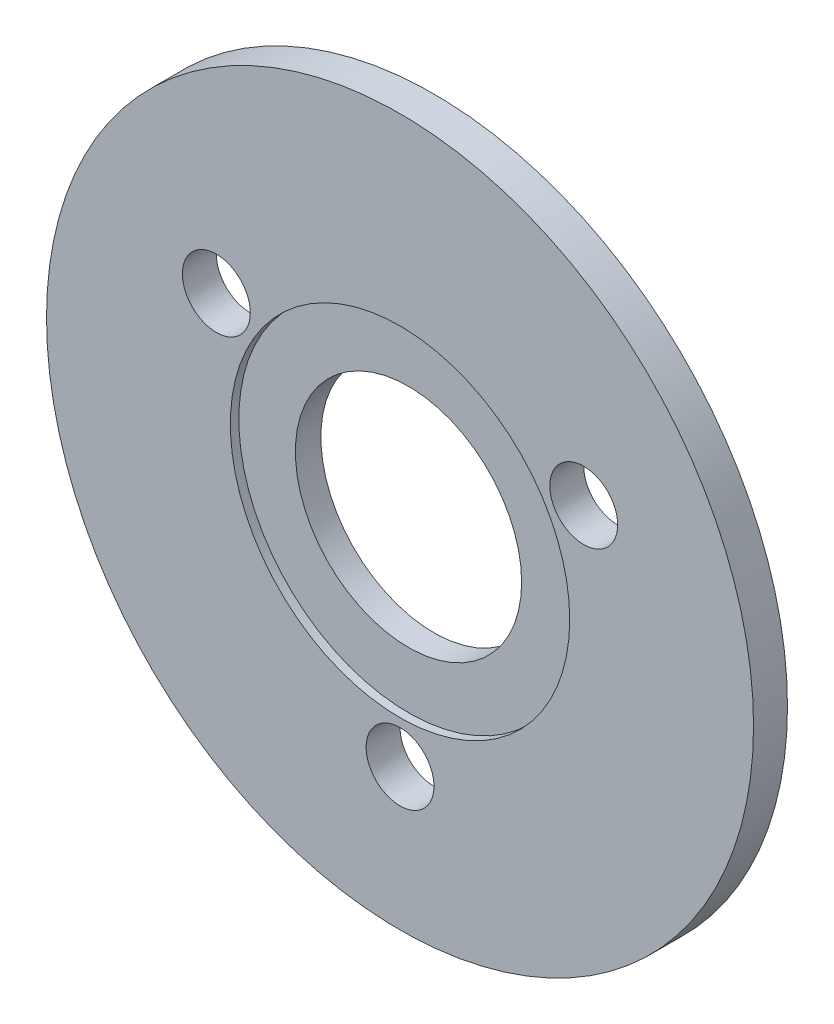
ISO-10303-21;
HEADER;
FILE_DESCRIPTION(('STEP AP214'),'2;1');
FILE_NAME('part.step','',(''),(''),'','','');
FILE_SCHEMA(('AUTOMOTIVE_DESIGN { 1 0 10303 214 1 1 1 1 }'));
ENDSEC;
DATA;
#1=APPLICATION_CONTEXT('core data for automotive mechanical design processes');
#2=APPLICATION_PROTOCOL_DEFINITION('international standard','automotive_design',2000,#1);
#3=PRODUCT_CONTEXT('',#1,'mechanical');
#4=PRODUCT('Part','Part','',(#3));
#5=PRODUCT_RELATED_PRODUCT_CATEGORY('part','',(#4));
#6=PRODUCT_DEFINITION_FORMATION('','',#4);
#7=PRODUCT_DEFINITION_CONTEXT('part definition',#1,'design');
#8=PRODUCT_DEFINITION('design','',#6,#7);
#9=PRODUCT_DEFINITION_SHAPE('','',#8);
#10=(LENGTH_UNIT() NAMED_UNIT(*) SI_UNIT(.MILLI.,.METRE.));
#11=(NAMED_UNIT(*) PLANE_ANGLE_UNIT() SI_UNIT($,.RADIAN.));
#12=(NAMED_UNIT(*) SI_UNIT($,.STERADIAN.) SOLID_ANGLE_UNIT());
#13=UNCERTAINTY_MEASURE_WITH_UNIT(LENGTH_MEASURE(1.E-05),#10,'distance_accuracy_value','');
#14=(GEOMETRIC_REPRESENTATION_CONTEXT(3) GLOBAL_UNCERTAINTY_ASSIGNED_CONTEXT((#13)) GLOBAL_UNIT_ASSIGNED_CONTEXT((#10,
#11,#12)) REPRESENTATION_CONTEXT('',''));
#15=CARTESIAN_POINT('',(0.,0.,0.));
#16=DIRECTION('',(0.,0.,1.));
#17=DIRECTION('',(1.,0.,0.));
#18=AXIS2_PLACEMENT_3D('',#15,#16,#17);
#19=CARTESIAN_POINT('',(0.,0.,1.2));
#20=DIRECTION('',(0.,0.,-1.));
#21=DIRECTION('',(-1.,0.,0.));
#22=AXIS2_PLACEMENT_3D('',#19,#20,#21);
#23=CYLINDRICAL_SURFACE('',#22,4.);
#24=CARTESIAN_POINT('',(0.,0.,0.));
#25=DIRECTION('',(0.,0.,1.));
#26=DIRECTION('',(1.,0.,0.));
#27=AXIS2_PLACEMENT_3D('',#24,#25,#26);
#28=CIRCLE('',#27,4.);
#29=CARTESIAN_POINT('',(4.,0.,0.));
#30=VERTEX_POINT('',#29);
#31=EDGE_CURVE('E44',#30,#30,#28,.T.);
#32=ORIENTED_EDGE('',*,*,#31,.F.);
#33=EDGE_LOOP('',(#32));
#34=FACE_BOUND('',#33,.T.);
#35=CARTESIAN_POINT('',(0.,0.,0.9));
#36=DIRECTION('',(0.,0.,1.));
#37=DIRECTION('',(1.,0.,0.));
#38=AXIS2_PLACEMENT_3D('',#35,#36,#37);
#39=CIRCLE('',#38,4.);
#40=CARTESIAN_POINT('',(4.,0.,0.9));
#41=VERTEX_POINT('',#40);
#42=EDGE_CURVE('E35',#41,#41,#39,.T.);
#43=ORIENTED_EDGE('',*,*,#42,.T.);
#44=EDGE_LOOP('',(#43));
#45=FACE_BOUND('',#44,.T.);
#46=ADVANCED_FACE('F31',(#34,#45),#23,.F.);
#47=CARTESIAN_POINT('',(0.,0.,1.2));
#48=DIRECTION('',(0.,0.,1.));
#49=DIRECTION('',(1.,0.,0.));
#50=AXIS2_PLACEMENT_3D('',#47,#48,#49);
#51=PLANE('',#50);
#52=CARTESIAN_POINT('',(0.,0.,1.2));
#53=DIRECTION('',(0.,0.,1.));
#54=DIRECTION('',(1.,0.,0.));
#55=AXIS2_PLACEMENT_3D('',#52,#53,#54);
#56=CIRCLE('',#55,6.);
#57=CARTESIAN_POINT('',(6.,0.,1.2));
#58=VERTEX_POINT('',#57);
#59=EDGE_CURVE('E66',#58,#58,#56,.T.);
#60=ORIENTED_EDGE('',*,*,#59,.F.);
#61=EDGE_LOOP('',(#60));
#62=FACE_BOUND('',#61,.T.);
#63=CARTESIAN_POINT('',(-6.49519052838322,3.75000000000012,1.2));
#64=DIRECTION('',(0.,0.,1.));
#65=DIRECTION('',(1.,0.,0.));
#66=AXIS2_PLACEMENT_3D('',#63,#64,#65);
#67=CIRCLE('',#66,1.2);
#68=CARTESIAN_POINT('',(-5.29519052838322,3.75000000000012,1.2));
#69=VERTEX_POINT('',#68);
#70=EDGE_CURVE('E52',#69,#69,#67,.T.);
#71=ORIENTED_EDGE('',*,*,#70,.F.);
#72=EDGE_LOOP('',(#71));
#73=FACE_BOUND('',#72,.T.);
#74=CARTESIAN_POINT('',(0.,0.,1.2));
#75=DIRECTION('',(0.,0.,1.));
#76=DIRECTION('',(1.,0.,0.));
#77=AXIS2_PLACEMENT_3D('',#74,#75,#76);
#78=CIRCLE('',#77,12.5);
#79=CARTESIAN_POINT('',(12.5,0.,1.2));
#80=VERTEX_POINT('',#79);
#81=EDGE_CURVE('E10',#80,#80,#78,.T.);
#82=ORIENTED_EDGE('',*,*,#81,.T.);
#83=EDGE_LOOP('',(#82));
#84=FACE_BOUND('',#83,.T.);
#85=CARTESIAN_POINT('',(0.,-7.5,1.2));
#86=DIRECTION('',(0.,0.,1.));
#87=DIRECTION('',(1.,0.,0.));
#88=AXIS2_PLACEMENT_3D('',#85,#86,#87);
#89=CIRCLE('',#88,1.2);
#90=CARTESIAN_POINT('',(1.2,-7.5,1.2));
#91=VERTEX_POINT('',#90);
#92=EDGE_CURVE('E48',#91,#91,#89,.T.);
#93=ORIENTED_EDGE('',*,*,#92,.F.);
#94=EDGE_LOOP('',(#93));
#95=FACE_BOUND('',#94,.T.);
#96=CARTESIAN_POINT('',(6.49519052838338,3.74999999999985,1.2));
#97=DIRECTION('',(0.,0.,1.));
#98=DIRECTION('',(1.,0.,0.));
#99=AXIS2_PLACEMENT_3D('',#96,#97,#98);
#100=CIRCLE('',#99,1.2);
#101=CARTESIAN_POINT('',(7.69519052838338,3.74999999999985,1.2));
#102=VERTEX_POINT('',#101);
#103=EDGE_CURVE('E58',#102,#102,#100,.T.);
#104=ORIENTED_EDGE('',*,*,#103,.F.);
#105=EDGE_LOOP('',(#104));
#106=FACE_BOUND('',#105,.T.);
#107=ADVANCED_FACE('F88',(#62,#73,#84,#95,#106),#51,.T.);
#108=CARTESIAN_POINT('',(0.,0.,0.));
#109=DIRECTION('',(0.,0.,1.));
#110=DIRECTION('',(1.,0.,0.));
#111=AXIS2_PLACEMENT_3D('',#108,#109,#110);
#112=PLANE('',#111);
#113=CARTESIAN_POINT('',(0.,0.,0.));
#114=DIRECTION('',(0.,0.,1.));
#115=DIRECTION('',(1.,0.,0.));
#116=AXIS2_PLACEMENT_3D('',#113,#114,#115);
#117=CIRCLE('',#116,12.5);
#118=CARTESIAN_POINT('',(12.5,0.,0.));
#119=VERTEX_POINT('',#118);
#120=EDGE_CURVE('E39',#119,#119,#117,.T.);
#121=ORIENTED_EDGE('',*,*,#120,.F.);
#122=EDGE_LOOP('',(#121));
#123=FACE_BOUND('',#122,.T.);
#124=ORIENTED_EDGE('',*,*,#31,.T.);
#125=EDGE_LOOP('',(#124));
#126=FACE_BOUND('',#125,.T.);
#127=CARTESIAN_POINT('',(0.,-7.5,0.));
#128=DIRECTION('',(0.,0.,1.));
#129=DIRECTION('',(1.,0.,0.));
#130=AXIS2_PLACEMENT_3D('',#127,#128,#129);
#131=CIRCLE('',#130,1.2);
#132=CARTESIAN_POINT('',(1.2,-7.5,0.));
#133=VERTEX_POINT('',#132);
#134=EDGE_CURVE('E49',#133,#133,#131,.T.);
#135=ORIENTED_EDGE('',*,*,#134,.T.);
#136=EDGE_LOOP('',(#135));
#137=FACE_BOUND('',#136,.T.);
#138=CARTESIAN_POINT('',(-6.49519052838322,3.75000000000012,0.));
#139=DIRECTION('',(0.,0.,1.));
#140=DIRECTION('',(1.,0.,0.));
#141=AXIS2_PLACEMENT_3D('',#138,#139,#140);
#142=CIRCLE('',#141,1.2);
#143=CARTESIAN_POINT('',(-5.29519052838322,3.75000000000012,0.));
#144=VERTEX_POINT('',#143);
#145=EDGE_CURVE('E55',#144,#144,#142,.T.);
#146=ORIENTED_EDGE('',*,*,#145,.T.);
#147=EDGE_LOOP('',(#146));
#148=FACE_BOUND('',#147,.T.);
#149=CARTESIAN_POINT('',(6.49519052838338,3.74999999999985,0.));
#150=DIRECTION('',(0.,0.,1.));
#151=DIRECTION('',(1.,0.,0.));
#152=AXIS2_PLACEMENT_3D('',#149,#150,#151);
#153=CIRCLE('',#152,1.2);
#154=CARTESIAN_POINT('',(7.69519052838338,3.74999999999985,0.));
#155=VERTEX_POINT('',#154);
#156=EDGE_CURVE('E61',#155,#155,#153,.T.);
#157=ORIENTED_EDGE('',*,*,#156,.T.);
#158=EDGE_LOOP('',(#157));
#159=FACE_BOUND('',#158,.T.);
#160=ADVANCED_FACE('F94',(#123,#126,#137,#148,#159),#112,.F.);
#161=CARTESIAN_POINT('',(0.,0.,1.2));
#162=DIRECTION('',(0.,0.,-1.));
#163=DIRECTION('',(-1.,0.,0.));
#164=AXIS2_PLACEMENT_3D('',#161,#162,#163);
#165=CYLINDRICAL_SURFACE('',#164,12.5);
#166=ORIENTED_EDGE('',*,*,#81,.F.);
#167=EDGE_LOOP('',(#166));
#168=FACE_BOUND('',#167,.T.);
#169=ORIENTED_EDGE('',*,*,#120,.T.);
#170=EDGE_LOOP('',(#169));
#171=FACE_BOUND('',#170,.T.);
#172=ADVANCED_FACE('F33',(#168,#171),#165,.T.);
#173=CARTESIAN_POINT('',(0.,-7.5,1.2));
#174=DIRECTION('',(0.,0.,-1.));
#175=DIRECTION('',(-1.,0.,0.));
#176=AXIS2_PLACEMENT_3D('',#173,#174,#175);
#177=CYLINDRICAL_SURFACE('',#176,1.2);
#178=ORIENTED_EDGE('',*,*,#92,.T.);
#179=EDGE_LOOP('',(#178));
#180=FACE_BOUND('',#179,.T.);
#181=ORIENTED_EDGE('',*,*,#134,.F.);
#182=EDGE_LOOP('',(#181));
#183=FACE_BOUND('',#182,.T.);
#184=ADVANCED_FACE('F99',(#180,#183),#177,.F.);
#185=CARTESIAN_POINT('',(-6.49519052838322,3.75000000000012,1.2));
#186=DIRECTION('',(0.,0.,-1.));
#187=DIRECTION('',(-1.,0.,0.));
#188=AXIS2_PLACEMENT_3D('',#185,#186,#187);
#189=CYLINDRICAL_SURFACE('',#188,1.2);
#190=ORIENTED_EDGE('',*,*,#70,.T.);
#191=EDGE_LOOP('',(#190));
#192=FACE_BOUND('',#191,.T.);
#193=ORIENTED_EDGE('',*,*,#145,.F.);
#194=EDGE_LOOP('',(#193));
#195=FACE_BOUND('',#194,.T.);
#196=ADVANCED_FACE('F117',(#192,#195),#189,.F.);
#197=CARTESIAN_POINT('',(6.49519052838338,3.74999999999985,1.2));
#198=DIRECTION('',(0.,0.,-1.));
#199=DIRECTION('',(-1.,0.,0.));
#200=AXIS2_PLACEMENT_3D('',#197,#198,#199);
#201=CYLINDRICAL_SURFACE('',#200,1.2);
#202=ORIENTED_EDGE('',*,*,#103,.T.);
#203=EDGE_LOOP('',(#202));
#204=FACE_BOUND('',#203,.T.);
#205=ORIENTED_EDGE('',*,*,#156,.F.);
#206=EDGE_LOOP('',(#205));
#207=FACE_BOUND('',#206,.T.);
#208=ADVANCED_FACE('F84',(#204,#207),#201,.F.);
#209=CARTESIAN_POINT('',(0.,0.,0.9));
#210=DIRECTION('',(0.,0.,1.));
#211=DIRECTION('',(1.,0.,0.));
#212=AXIS2_PLACEMENT_3D('',#209,#210,#211);
#213=CYLINDRICAL_SURFACE('',#212,6.);
#214=CARTESIAN_POINT('',(0.,0.,0.9));
#215=DIRECTION('',(0.,0.,1.));
#216=DIRECTION('',(1.,0.,0.));
#217=AXIS2_PLACEMENT_3D('',#214,#215,#216);
#218=CIRCLE('',#217,6.);
#219=CARTESIAN_POINT('',(6.,0.,0.9));
#220=VERTEX_POINT('',#219);
#221=EDGE_CURVE('E69',#220,#220,#218,.T.);
#222=ORIENTED_EDGE('',*,*,#221,.F.);
#223=EDGE_LOOP('',(#222));
#224=FACE_BOUND('',#223,.T.);
#225=ORIENTED_EDGE('',*,*,#59,.T.);
#226=EDGE_LOOP('',(#225));
#227=FACE_BOUND('',#226,.T.);
#228=ADVANCED_FACE('F79',(#224,#227),#213,.F.);
#229=CARTESIAN_POINT('',(0.,0.,0.9));
#230=DIRECTION('',(0.,0.,1.));
#231=DIRECTION('',(1.,0.,0.));
#232=AXIS2_PLACEMENT_3D('',#229,#230,#231);
#233=PLANE('',#232);
#234=ORIENTED_EDGE('',*,*,#42,.F.);
#235=EDGE_LOOP('',(#234));
#236=FACE_BOUND('',#235,.T.);
#237=ORIENTED_EDGE('',*,*,#221,.T.);
#238=EDGE_LOOP('',(#237));
#239=FACE_BOUND('',#238,.T.);
#240=ADVANCED_FACE('F77',(#236,#239),#233,.T.);
#241=CLOSED_SHELL('',(#46,#107,#160,#172,#184,#196,#208,#228,#240));
#242=MANIFOLD_SOLID_BREP('B2',#241);
#243=ADVANCED_BREP_SHAPE_REPRESENTATION('',(#18,#242),#14);
#244=SHAPE_DEFINITION_REPRESENTATION(#9,#243);
ENDSEC;
END-ISO-10303-21;
